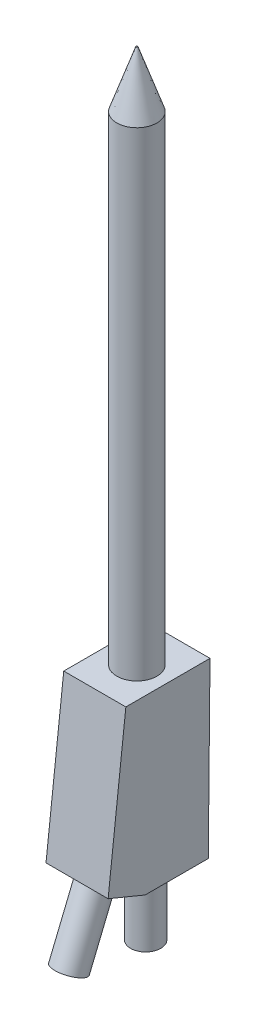
ISO-10303-21;
HEADER;
FILE_DESCRIPTION(('STEP AP214'),'2;1');
FILE_NAME('part.step','',(''),(''),'','','');
FILE_SCHEMA(('AUTOMOTIVE_DESIGN { 1 0 10303 214 1 1 1 1 }'));
ENDSEC;
DATA;
#1=APPLICATION_CONTEXT('core data for automotive mechanical design processes');
#2=APPLICATION_PROTOCOL_DEFINITION('international standard','automotive_design',2000,#1);
#3=PRODUCT_CONTEXT('',#1,'mechanical');
#4=PRODUCT('Part','Part','',(#3));
#5=PRODUCT_RELATED_PRODUCT_CATEGORY('part','',(#4));
#6=PRODUCT_DEFINITION_FORMATION('','',#4);
#7=PRODUCT_DEFINITION_CONTEXT('part definition',#1,'design');
#8=PRODUCT_DEFINITION('design','',#6,#7);
#9=PRODUCT_DEFINITION_SHAPE('','',#8);
#10=(LENGTH_UNIT() NAMED_UNIT(*) SI_UNIT(.MILLI.,.METRE.));
#11=(NAMED_UNIT(*) PLANE_ANGLE_UNIT() SI_UNIT($,.RADIAN.));
#12=(NAMED_UNIT(*) SI_UNIT($,.STERADIAN.) SOLID_ANGLE_UNIT());
#13=UNCERTAINTY_MEASURE_WITH_UNIT(LENGTH_MEASURE(1.E-05),#10,'distance_accuracy_value','');
#14=(GEOMETRIC_REPRESENTATION_CONTEXT(3) GLOBAL_UNCERTAINTY_ASSIGNED_CONTEXT((#13)) GLOBAL_UNIT_ASSIGNED_CONTEXT((#10,
#11,#12)) REPRESENTATION_CONTEXT('',''));
#15=CARTESIAN_POINT('',(0.,0.,0.));
#16=DIRECTION('',(0.,0.,1.));
#17=DIRECTION('',(1.,0.,0.));
#18=AXIS2_PLACEMENT_3D('',#15,#16,#17);
#19=CARTESIAN_POINT('',(0.,50.,0.));
#20=DIRECTION('',(0.,-1.,0.));
#21=DIRECTION('',(0.,0.,-1.));
#22=AXIS2_PLACEMENT_3D('',#19,#20,#21);
#23=CYLINDRICAL_SURFACE('',#22,2.);
#24=CARTESIAN_POINT('',(0.,50.,0.));
#25=DIRECTION('',(0.,1.,0.));
#26=DIRECTION('',(0.,0.,1.));
#27=AXIS2_PLACEMENT_3D('',#24,#25,#26);
#28=CIRCLE('',#27,2.);
#29=CARTESIAN_POINT('',(2.,50.,0.));
#30=VERTEX_POINT('',#29);
#31=EDGE_CURVE('E129',#30,#30,#28,.T.);
#32=ORIENTED_EDGE('',*,*,#31,.F.);
#33=EDGE_LOOP('',(#32));
#34=FACE_BOUND('',#33,.T.);
#35=CARTESIAN_POINT('',(0.,2.17153908732998,0.));
#36=DIRECTION('',(0.,-1.,0.));
#37=DIRECTION('',(0.,0.,-1.));
#38=AXIS2_PLACEMENT_3D('',#35,#36,#37);
#39=CIRCLE('',#38,2.);
#40=CARTESIAN_POINT('',(0.,2.17153908732998,-2.));
#41=VERTEX_POINT('',#40);
#42=EDGE_CURVE('E132',#41,#41,#39,.T.);
#43=ORIENTED_EDGE('',*,*,#42,.F.);
#44=EDGE_LOOP('',(#43));
#45=FACE_BOUND('',#44,.T.);
#46=ADVANCED_FACE('F35',(#34,#45),#23,.T.);
#47=CARTESIAN_POINT('',(0.,55.6,0.));
#48=DIRECTION('',(0.,-1.,0.));
#49=DIRECTION('',(1.,0.,0.));
#50=AXIS2_PLACEMENT_3D('',#47,#48,#49);
#51=PLANE('',#50);
#52=CARTESIAN_POINT('',(0.,55.6,0.));
#53=DIRECTION('',(0.,1.,0.));
#54=DIRECTION('',(-1.,0.,0.));
#55=AXIS2_PLACEMENT_3D('',#52,#53,#54);
#56=CIRCLE('',#55,0.0785280318951873);
#57=CARTESIAN_POINT('',(0.0785280318951881,55.6,0.));
#58=VERTEX_POINT('',#57);
#59=EDGE_CURVE('E126',#58,#58,#56,.T.);
#60=ORIENTED_EDGE('',*,*,#59,.T.);
#61=EDGE_LOOP('',(#60));
#62=FACE_BOUND('',#61,.T.);
#63=ADVANCED_FACE('F161',(#62),#51,.F.);
#64=CARTESIAN_POINT('',(0.,50.,0.));
#65=DIRECTION('',(0.,-1.,0.));
#66=DIRECTION('',(1.,0.,0.));
#67=AXIS2_PLACEMENT_3D('',#64,#65,#66);
#68=CONICAL_SURFACE('',#67,2.,0.330532538944102);
#69=CARTESIAN_POINT('',(0.0785280318951881,55.6,0.));
#70=CARTESIAN_POINT('',(0.0985433648962807,55.5416666666667,0.));
#71=CARTESIAN_POINT('',(0.118558697897372,55.4833333333333,0.));
#72=CARTESIAN_POINT('',(0.158589363899555,55.3666666666667,0.));
#73=CARTESIAN_POINT('',(0.178604696900647,55.3083333333333,0.));
#74=CARTESIAN_POINT('',(0.218635362902831,55.1916666666667,0.));
#75=CARTESIAN_POINT('',(0.238650695903923,55.1333333333333,0.));
#76=CARTESIAN_POINT('',(0.278681361906106,55.0166666666667,0.));
#77=CARTESIAN_POINT('',(0.298696694907198,54.9583333333333,0.));
#78=CARTESIAN_POINT('',(0.338727360909381,54.8416666666667,0.));
#79=CARTESIAN_POINT('',(0.358742693910474,54.7833333333333,0.));
#80=CARTESIAN_POINT('',(0.398773359912657,54.6666666666667,0.));
#81=CARTESIAN_POINT('',(0.418788692913749,54.6083333333333,0.));
#82=CARTESIAN_POINT('',(0.458819358915932,54.4916666666667,0.));
#83=CARTESIAN_POINT('',(0.478834691917024,54.4333333333333,0.));
#84=CARTESIAN_POINT('',(0.518865357919208,54.3166666666667,0.));
#85=CARTESIAN_POINT('',(0.538880690920299,54.2583333333333,0.));
#86=CARTESIAN_POINT('',(0.578911356922483,54.1416666666667,0.));
#87=CARTESIAN_POINT('',(0.598926689923575,54.0833333333333,0.));
#88=CARTESIAN_POINT('',(0.638957355925759,53.9666666666667,0.));
#89=CARTESIAN_POINT('',(0.658972688926851,53.9083333333333,0.));
#90=CARTESIAN_POINT('',(0.699003354929034,53.7916666666667,0.));
#91=CARTESIAN_POINT('',(0.719018687930126,53.7333333333333,0.));
#92=CARTESIAN_POINT('',(0.75904935393231,53.6166666666667,0.));
#93=CARTESIAN_POINT('',(0.779064686933402,53.5583333333333,0.));
#94=CARTESIAN_POINT('',(0.819095352935585,53.4416666666667,0.));
#95=CARTESIAN_POINT('',(0.839110685936676,53.3833333333333,0.));
#96=CARTESIAN_POINT('',(0.87914135193886,53.2666666666667,0.));
#97=CARTESIAN_POINT('',(0.899156684939952,53.2083333333333,0.));
#98=CARTESIAN_POINT('',(0.939187350942136,53.0916666666667,0.));
#99=CARTESIAN_POINT('',(0.959202683943228,53.0333333333333,0.));
#100=CARTESIAN_POINT('',(0.999233349945411,52.9166666666667,0.));
#101=CARTESIAN_POINT('',(1.0192486829465,52.8583333333333,0.));
#102=CARTESIAN_POINT('',(1.05927934894869,52.7416666666667,0.));
#103=CARTESIAN_POINT('',(1.07929468194978,52.6833333333333,0.));
#104=CARTESIAN_POINT('',(1.11932534795196,52.5666666666667,0.));
#105=CARTESIAN_POINT('',(1.13934068095305,52.5083333333333,0.));
#106=CARTESIAN_POINT('',(1.17937134695524,52.3916666666667,0.));
#107=CARTESIAN_POINT('',(1.19938667995633,52.3333333333333,0.));
#108=CARTESIAN_POINT('',(1.23941734595851,52.2166666666667,0.));
#109=CARTESIAN_POINT('',(1.25943267895961,52.1583333333333,0.));
#110=CARTESIAN_POINT('',(1.29946334496179,52.0416666666667,0.));
#111=CARTESIAN_POINT('',(1.31947867796288,51.9833333333333,0.));
#112=CARTESIAN_POINT('',(1.35950934396506,51.8666666666667,0.));
#113=CARTESIAN_POINT('',(1.37952467696616,51.8083333333333,0.));
#114=CARTESIAN_POINT('',(1.41955534296834,51.6916666666667,0.));
#115=CARTESIAN_POINT('',(1.43957067596943,51.6333333333333,0.));
#116=CARTESIAN_POINT('',(1.47960134197161,51.5166666666667,0.));
#117=CARTESIAN_POINT('',(1.49961667497271,51.4583333333333,0.));
#118=CARTESIAN_POINT('',(1.53964734097489,51.3416666666667,0.));
#119=CARTESIAN_POINT('',(1.55966267397598,51.2833333333333,0.));
#120=CARTESIAN_POINT('',(1.59969333997817,51.1666666666667,0.));
#121=CARTESIAN_POINT('',(1.61970867297926,51.1083333333333,0.));
#122=CARTESIAN_POINT('',(1.65973933898144,50.9916666666667,0.));
#123=CARTESIAN_POINT('',(1.67975467198253,50.9333333333333,0.));
#124=CARTESIAN_POINT('',(1.71978533798472,50.8166666666667,0.));
#125=CARTESIAN_POINT('',(1.73980067098581,50.7583333333333,0.));
#126=CARTESIAN_POINT('',(1.77983133698799,50.6416666666667,0.));
#127=CARTESIAN_POINT('',(1.79984666998908,50.5833333333333,0.));
#128=CARTESIAN_POINT('',(1.83987733599127,50.4666666666667,0.));
#129=CARTESIAN_POINT('',(1.85989266899236,50.4083333333333,0.));
#130=CARTESIAN_POINT('',(1.89992333499454,50.2916666666667,0.));
#131=CARTESIAN_POINT('',(1.91993866799563,50.2333333333333,0.));
#132=CARTESIAN_POINT('',(1.95996933399782,50.1166666666667,0.));
#133=CARTESIAN_POINT('',(1.97998466699891,50.0583333333333,0.));
#134=CARTESIAN_POINT('',(2.,50.,0.));
#135=B_SPLINE_CURVE_WITH_KNOTS('',3,(#69,#70,#71,#72,#73,#74,#75,#76,#77,#78,#79,#80,#81,#82,
#83,#84,#85,#86,#87,#88,#89,#90,#91,#92,#93,#94,#95,#96,#97,#98,#99,#100,#101,#102,#103,#104,
#105,#106,#107,#108,#109,#110,#111,#112,#113,#114,#115,#116,#117,#118,#119,#120,#121,#122,#123,
#124,#125,#126,#127,#128,#129,#130,#131,#132,#133,#134),.UNSPECIFIED.,.F.,.F.,(4,2,2,2,2,2,2,2,
2,2,2,2,2,2,2,2,2,2,2,2,2,2,2,2,2,2,2,2,2,2,2,2,4),(0.,0.185014923712384,0.370029847424776,
0.555044771137167,0.740059694849558,0.925074618561942,1.11008954227433,1.29510446598672,
1.48011938969912,1.6651343134115,1.85014923712389,2.03516416083628,2.22017908454867,
2.40519400826106,2.59020893197345,2.77522385568584,2.96023877939823,3.14525370311062,
3.33026862682301,3.5152835505354,3.70029847424779,3.88531339796018,4.07032832167257,
4.25534324538496,4.44035816909735,4.62537309280974,4.81038801652213,4.99540294023452,
5.18041786394691,5.3654327876593,5.55044771137169,5.73546263508408,5.92047755879646),.UNSPECIFIED.);
#136=EDGE_CURVE('BSEAM168',#58,#30,#135,.T.);
#137=ORIENTED_EDGE('',*,*,#59,.F.);
#138=ORIENTED_EDGE('',*,*,#31,.T.);
#139=ORIENTED_EDGE('',*,*,#136,.T.);
#140=ORIENTED_EDGE('',*,*,#136,.F.);
#141=EDGE_LOOP('',(#137,#139,#138,#140));
#142=FACE_BOUND('',#141,.T.);
#143=ADVANCED_FACE('F168',(#142),#68,.T.);
#144=CARTESIAN_POINT('',(3.1,-13.52846091267,5.97010687558689));
#145=DIRECTION('',(0.,-0.112035833047176,-0.993704167302032));
#146=DIRECTION('',(0.,0.993704167302032,-0.112035833047177));
#147=AXIS2_PLACEMENT_3D('',#144,#145,#146);
#148=PLANE('',#147);
#149=DIRECTION('',(0.,-0.993704167302032,0.112035833047176));
#150=VECTOR('',#149,1.);
#151=CARTESIAN_POINT('',(-3.1,-13.52846091267,5.97010687558689));
#152=LINE('',#151,#150);
#153=CARTESIAN_POINT('',(-3.1,2.17153908732998,4.2));
#154=VERTEX_POINT('',#153);
#155=CARTESIAN_POINT('',(-3.1,-13.52846091267,5.97010687558689));
#156=VERTEX_POINT('',#155);
#157=EDGE_CURVE('E111',#154,#156,#152,.T.);
#158=ORIENTED_EDGE('',*,*,#157,.T.);
#159=DIRECTION('',(-1.,0.,0.));
#160=VECTOR('',#159,1.);
#161=CARTESIAN_POINT('',(3.1,-13.52846091267,5.97010687558689));
#162=LINE('',#161,#160);
#163=CARTESIAN_POINT('',(3.1,-13.52846091267,5.97010687558689));
#164=VERTEX_POINT('',#163);
#165=EDGE_CURVE('E124',#164,#156,#162,.T.);
#166=ORIENTED_EDGE('',*,*,#165,.F.);
#167=DIRECTION('',(0.,-0.993704167302032,0.112035833047176));
#168=VECTOR('',#167,1.);
#169=CARTESIAN_POINT('',(3.1,-13.52846091267,5.97010687558689));
#170=LINE('',#169,#168);
#171=CARTESIAN_POINT('',(3.1,2.17153908732998,4.2));
#172=VERTEX_POINT('',#171);
#173=EDGE_CURVE('E120',#172,#164,#170,.T.);
#174=ORIENTED_EDGE('',*,*,#173,.F.);
#175=DIRECTION('',(-1.,0.,0.));
#176=VECTOR('',#175,1.);
#177=CARTESIAN_POINT('',(3.1,2.17153908732998,4.2));
#178=LINE('',#177,#176);
#179=EDGE_CURVE('E107',#172,#154,#178,.T.);
#180=ORIENTED_EDGE('',*,*,#179,.T.);
#181=EDGE_LOOP('',(#158,#166,#174,#180));
#182=FACE_BOUND('',#181,.T.);
#183=ADVANCED_FACE('F141',(#182),#148,.F.);
#184=CARTESIAN_POINT('',(3.1,-15.0483293280271,2.27010687558689));
#185=DIRECTION('',(0.,0.925,-0.379967103839266));
#186=DIRECTION('',(0.,0.379967103839266,0.925));
#187=AXIS2_PLACEMENT_3D('',#184,#185,#186);
#188=PLANE('',#187);
#189=CARTESIAN_POINT('',(0.,-14.2883951203486,4.12010687558689));
#190=DIRECTION('',(0.,0.925,-0.379967103839266));
#191=DIRECTION('',(0.,0.379967103839266,0.925));
#192=AXIS2_PLACEMENT_3D('',#189,#190,#191);
#193=CIRCLE('',#192,1.5);
#194=CARTESIAN_POINT('',(0.,-13.7184444645897,5.50760687558689));
#195=VERTEX_POINT('',#194);
#196=EDGE_CURVE('E43',#195,#195,#193,.F.);
#197=ORIENTED_EDGE('',*,*,#196,.F.);
#198=EDGE_LOOP('',(#197));
#199=FACE_BOUND('',#198,.T.);
#200=DIRECTION('',(0.,-0.379967103839266,-0.925));
#201=VECTOR('',#200,1.);
#202=CARTESIAN_POINT('',(-3.1,-15.0483293280271,2.27010687558689));
#203=LINE('',#202,#201);
#204=CARTESIAN_POINT('',(-3.1,-15.0483293280271,2.27010687558689));
#205=VERTEX_POINT('',#204);
#206=EDGE_CURVE('E114',#156,#205,#203,.T.);
#207=ORIENTED_EDGE('',*,*,#206,.T.);
#208=DIRECTION('',(-1.,0.,0.));
#209=VECTOR('',#208,1.);
#210=CARTESIAN_POINT('',(3.1,-15.0483293280271,2.27010687558689));
#211=LINE('',#210,#209);
#212=CARTESIAN_POINT('',(3.1,-15.0483293280271,2.27010687558689));
#213=VERTEX_POINT('',#212);
#214=EDGE_CURVE('E102',#213,#205,#211,.T.);
#215=ORIENTED_EDGE('',*,*,#214,.F.);
#216=DIRECTION('',(0.,-0.379967103839266,-0.925));
#217=VECTOR('',#216,1.);
#218=CARTESIAN_POINT('',(3.1,-15.0483293280271,2.27010687558689));
#219=LINE('',#218,#217);
#220=EDGE_CURVE('E86',#164,#213,#219,.T.);
#221=ORIENTED_EDGE('',*,*,#220,.F.);
#222=ORIENTED_EDGE('',*,*,#165,.T.);
#223=EDGE_LOOP('',(#207,#215,#221,#222));
#224=FACE_BOUND('',#223,.T.);
#225=ADVANCED_FACE('F139',(#199,#224),#188,.F.);
#226=CARTESIAN_POINT('',(3.1,-15.0483293280271,-4.02989312441311));
#227=DIRECTION('',(0.,1.,0.));
#228=DIRECTION('',(0.,0.,1.));
#229=AXIS2_PLACEMENT_3D('',#226,#227,#228);
#230=PLANE('',#229);
#231=CARTESIAN_POINT('',(0.,-15.0483293280271,-0.879893124413112));
#232=DIRECTION('',(0.,1.,0.));
#233=DIRECTION('',(0.,0.,1.));
#234=AXIS2_PLACEMENT_3D('',#231,#232,#233);
#235=CIRCLE('',#234,1.5);
#236=CARTESIAN_POINT('',(0.,-15.0483293280271,0.620106875586889));
#237=VERTEX_POINT('',#236);
#238=EDGE_CURVE('E11',#237,#237,#235,.F.);
#239=ORIENTED_EDGE('',*,*,#238,.F.);
#240=EDGE_LOOP('',(#239));
#241=FACE_BOUND('',#240,.T.);
#242=DIRECTION('',(0.,0.,-1.));
#243=VECTOR('',#242,1.);
#244=CARTESIAN_POINT('',(-3.1,-15.0483293280271,-4.02989312441311));
#245=LINE('',#244,#243);
#246=CARTESIAN_POINT('',(-3.1,-15.0483293280271,-4.02989312441311));
#247=VERTEX_POINT('',#246);
#248=EDGE_CURVE('E101',#205,#247,#245,.T.);
#249=ORIENTED_EDGE('',*,*,#248,.T.);
#250=DIRECTION('',(-1.,0.,0.));
#251=VECTOR('',#250,1.);
#252=CARTESIAN_POINT('',(3.1,-15.0483293280271,-4.02989312441311));
#253=LINE('',#252,#251);
#254=CARTESIAN_POINT('',(3.1,-15.0483293280271,-4.02989312441311));
#255=VERTEX_POINT('',#254);
#256=EDGE_CURVE('E98',#255,#247,#253,.T.);
#257=ORIENTED_EDGE('',*,*,#256,.F.);
#258=DIRECTION('',(0.,0.,-1.));
#259=VECTOR('',#258,1.);
#260=CARTESIAN_POINT('',(3.1,-15.0483293280271,-4.02989312441311));
#261=LINE('',#260,#259);
#262=EDGE_CURVE('E90',#213,#255,#261,.T.);
#263=ORIENTED_EDGE('',*,*,#262,.F.);
#264=ORIENTED_EDGE('',*,*,#214,.T.);
#265=EDGE_LOOP('',(#249,#257,#263,#264));
#266=FACE_BOUND('',#265,.T.);
#267=ADVANCED_FACE('F99',(#241,#266),#230,.F.);
#268=CARTESIAN_POINT('',(3.1,2.17153908732998,-4.2));
#269=DIRECTION('',(0.,0.00987804158152196,0.999951210957071));
#270=DIRECTION('',(0.,-0.999951210957072,0.00987804158152196));
#271=AXIS2_PLACEMENT_3D('',#268,#269,#270);
#272=PLANE('',#271);
#273=DIRECTION('',(0.,0.999951210957072,-0.00987804158152196));
#274=VECTOR('',#273,1.);
#275=CARTESIAN_POINT('',(-3.1,2.17153908732998,-4.2));
#276=LINE('',#275,#274);
#277=CARTESIAN_POINT('',(-3.1,2.17153908732998,-4.2));
#278=VERTEX_POINT('',#277);
#279=EDGE_CURVE('E71',#247,#278,#276,.T.);
#280=ORIENTED_EDGE('',*,*,#279,.T.);
#281=DIRECTION('',(-1.,0.,0.));
#282=VECTOR('',#281,1.);
#283=CARTESIAN_POINT('',(3.1,2.17153908732998,-4.2));
#284=LINE('',#283,#282);
#285=CARTESIAN_POINT('',(3.1,2.17153908732998,-4.2));
#286=VERTEX_POINT('',#285);
#287=EDGE_CURVE('E103',#286,#278,#284,.T.);
#288=ORIENTED_EDGE('',*,*,#287,.F.);
#289=DIRECTION('',(0.,0.999951210957072,-0.00987804158152196));
#290=VECTOR('',#289,1.);
#291=CARTESIAN_POINT('',(3.1,2.17153908732998,-4.2));
#292=LINE('',#291,#290);
#293=EDGE_CURVE('E94',#255,#286,#292,.T.);
#294=ORIENTED_EDGE('',*,*,#293,.F.);
#295=ORIENTED_EDGE('',*,*,#256,.T.);
#296=EDGE_LOOP('',(#280,#288,#294,#295));
#297=FACE_BOUND('',#296,.T.);
#298=ADVANCED_FACE('F105',(#297),#272,.F.);
#299=CARTESIAN_POINT('',(3.1,2.17153908732998,4.2));
#300=DIRECTION('',(0.,-1.,0.));
#301=DIRECTION('',(0.,0.,-1.));
#302=AXIS2_PLACEMENT_3D('',#299,#300,#301);
#303=PLANE('',#302);
#304=ORIENTED_EDGE('',*,*,#42,.T.);
#305=EDGE_LOOP('',(#304));
#306=FACE_BOUND('',#305,.T.);
#307=DIRECTION('',(0.,0.,1.));
#308=VECTOR('',#307,1.);
#309=CARTESIAN_POINT('',(-3.1,2.17153908732998,4.2));
#310=LINE('',#309,#308);
#311=EDGE_CURVE('E77',#278,#154,#310,.T.);
#312=ORIENTED_EDGE('',*,*,#311,.T.);
#313=ORIENTED_EDGE('',*,*,#179,.F.);
#314=DIRECTION('',(0.,0.,1.));
#315=VECTOR('',#314,1.);
#316=CARTESIAN_POINT('',(3.1,2.17153908732998,4.2));
#317=LINE('',#316,#315);
#318=EDGE_CURVE('E51',#286,#172,#317,.T.);
#319=ORIENTED_EDGE('',*,*,#318,.F.);
#320=ORIENTED_EDGE('',*,*,#287,.T.);
#321=EDGE_LOOP('',(#312,#313,#319,#320));
#322=FACE_BOUND('',#321,.T.);
#323=ADVANCED_FACE('F149',(#306,#322),#303,.F.);
#324=CARTESIAN_POINT('',(3.1,0.,0.));
#325=DIRECTION('',(-1.,0.,0.));
#326=DIRECTION('',(0.,0.,1.));
#327=AXIS2_PLACEMENT_3D('',#324,#325,#326);
#328=PLANE('',#327);
#329=ORIENTED_EDGE('',*,*,#173,.T.);
#330=ORIENTED_EDGE('',*,*,#220,.T.);
#331=ORIENTED_EDGE('',*,*,#262,.T.);
#332=ORIENTED_EDGE('',*,*,#293,.T.);
#333=ORIENTED_EDGE('',*,*,#318,.T.);
#334=EDGE_LOOP('',(#329,#330,#331,#332,#333));
#335=FACE_BOUND('',#334,.T.);
#336=ADVANCED_FACE('F92',(#335),#328,.F.);
#337=CARTESIAN_POINT('',(-3.1,0.,0.));
#338=DIRECTION('',(-1.,0.,0.));
#339=DIRECTION('',(0.,0.,1.));
#340=AXIS2_PLACEMENT_3D('',#337,#338,#339);
#341=PLANE('',#340);
#342=ORIENTED_EDGE('',*,*,#157,.F.);
#343=ORIENTED_EDGE('',*,*,#311,.F.);
#344=ORIENTED_EDGE('',*,*,#279,.F.);
#345=ORIENTED_EDGE('',*,*,#248,.F.);
#346=ORIENTED_EDGE('',*,*,#206,.F.);
#347=EDGE_LOOP('',(#342,#343,#344,#345,#346));
#348=FACE_BOUND('',#347,.T.);
#349=ADVANCED_FACE('F146',(#348),#341,.T.);
#350=CARTESIAN_POINT('',(0.,-20.7633951203485,6.77987660246175));
#351=DIRECTION('',(0.,0.925,-0.379967103839266));
#352=DIRECTION('',(0.,0.379967103839266,0.925));
#353=AXIS2_PLACEMENT_3D('',#350,#351,#352);
#354=CYLINDRICAL_SURFACE('',#353,1.5);
#355=CARTESIAN_POINT('',(0.,-20.7633951203485,6.77987660246175));
#356=DIRECTION('',(0.,-0.925,0.379967103839266));
#357=DIRECTION('',(0.,-0.379967103839266,-0.925));
#358=AXIS2_PLACEMENT_3D('',#355,#356,#357);
#359=CIRCLE('',#358,1.5);
#360=CARTESIAN_POINT('',(0.,-21.3333457761074,5.39237660246175));
#361=VERTEX_POINT('',#360);
#362=EDGE_CURVE('E115',#361,#361,#359,.T.);
#363=ORIENTED_EDGE('',*,*,#362,.F.);
#364=EDGE_LOOP('',(#363));
#365=FACE_BOUND('',#364,.T.);
#366=ORIENTED_EDGE('',*,*,#196,.T.);
#367=EDGE_LOOP('',(#366));
#368=FACE_BOUND('',#367,.T.);
#369=ADVANCED_FACE('F137',(#365,#368),#354,.T.);
#370=CARTESIAN_POINT('',(0.,-20.7633951203485,6.77987660246175));
#371=DIRECTION('',(0.,-0.925,0.379967103839266));
#372=DIRECTION('',(0.,-0.379967103839266,-0.925));
#373=AXIS2_PLACEMENT_3D('',#370,#371,#372);
#374=PLANE('',#373);
#375=ORIENTED_EDGE('',*,*,#362,.T.);
#376=EDGE_LOOP('',(#375));
#377=FACE_BOUND('',#376,.T.);
#378=ADVANCED_FACE('F192',(#377),#374,.T.);
#379=CARTESIAN_POINT('',(0.,-22.0483293280271,-0.879893124413114));
#380=DIRECTION('',(0.,1.,0.));
#381=DIRECTION('',(0.,0.,1.));
#382=AXIS2_PLACEMENT_3D('',#379,#380,#381);
#383=CYLINDRICAL_SURFACE('',#382,1.5);
#384=CARTESIAN_POINT('',(0.,-22.0483293280271,-0.879893124413114));
#385=DIRECTION('',(0.,-1.,0.));
#386=DIRECTION('',(0.,0.,-1.));
#387=AXIS2_PLACEMENT_3D('',#384,#385,#386);
#388=CIRCLE('',#387,1.5);
#389=CARTESIAN_POINT('',(0.,-22.0483293280271,-2.37989312441311));
#390=VERTEX_POINT('',#389);
#391=EDGE_CURVE('E282',#390,#390,#388,.T.);
#392=ORIENTED_EDGE('',*,*,#391,.F.);
#393=EDGE_LOOP('',(#392));
#394=FACE_BOUND('',#393,.T.);
#395=ORIENTED_EDGE('',*,*,#238,.T.);
#396=EDGE_LOOP('',(#395));
#397=FACE_BOUND('',#396,.T.);
#398=ADVANCED_FACE('F189',(#394,#397),#383,.T.);
#399=CARTESIAN_POINT('',(0.,-22.0483293280271,-0.879893124413114));
#400=DIRECTION('',(0.,-1.,0.));
#401=DIRECTION('',(0.,0.,-1.));
#402=AXIS2_PLACEMENT_3D('',#399,#400,#401);
#403=PLANE('',#402);
#404=ORIENTED_EDGE('',*,*,#391,.T.);
#405=EDGE_LOOP('',(#404));
#406=FACE_BOUND('',#405,.T.);
#407=ADVANCED_FACE('F191',(#406),#403,.T.);
#408=CLOSED_SHELL('',(#46,#63,#143,#183,#225,#267,#298,#323,#336,#349,#369,#378,#398,#407));
#409=MANIFOLD_SOLID_BREP('B2',#408);
#410=ADVANCED_BREP_SHAPE_REPRESENTATION('',(#18,#409),#14);
#411=SHAPE_DEFINITION_REPRESENTATION(#9,#410);
ENDSEC;
END-ISO-10303-21;
